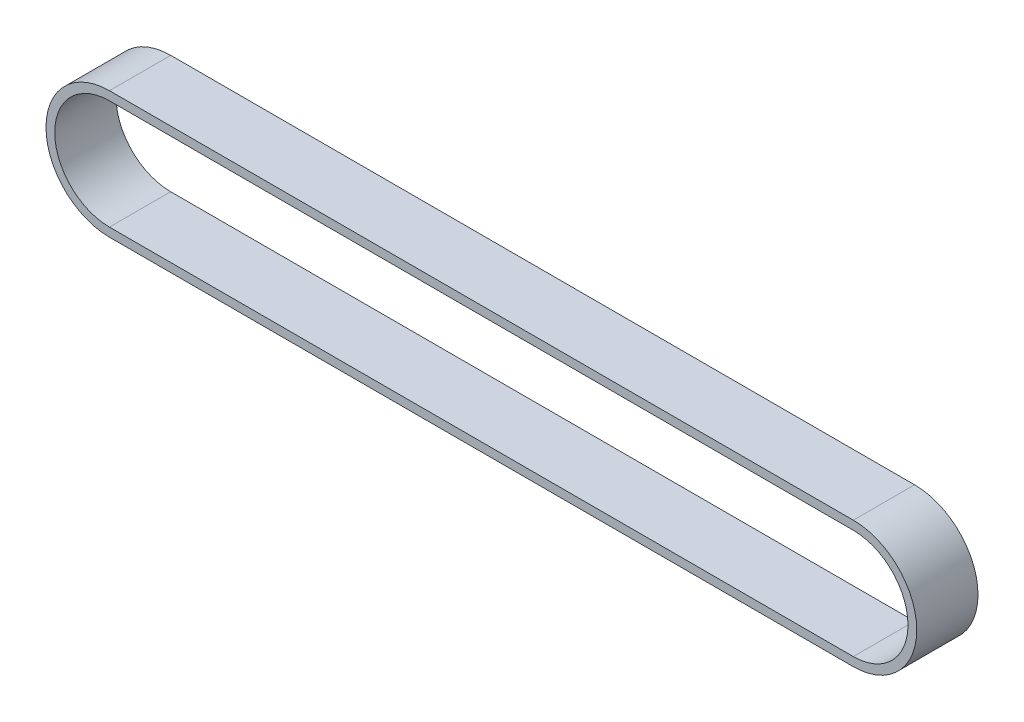
ISO-10303-21;
HEADER;
FILE_DESCRIPTION(('STEP AP214'),'2;1');
FILE_NAME('part.step','',(''),(''),'','','');
FILE_SCHEMA(('AUTOMOTIVE_DESIGN { 1 0 10303 214 1 1 1 1 }'));
ENDSEC;
DATA;
#1=APPLICATION_CONTEXT('core data for automotive mechanical design processes');
#2=APPLICATION_PROTOCOL_DEFINITION('international standard','automotive_design',2000,#1);
#3=PRODUCT_CONTEXT('',#1,'mechanical');
#4=PRODUCT('Part','Part','',(#3));
#5=PRODUCT_RELATED_PRODUCT_CATEGORY('part','',(#4));
#6=PRODUCT_DEFINITION_FORMATION('','',#4);
#7=PRODUCT_DEFINITION_CONTEXT('part definition',#1,'design');
#8=PRODUCT_DEFINITION('design','',#6,#7);
#9=PRODUCT_DEFINITION_SHAPE('','',#8);
#10=(LENGTH_UNIT() NAMED_UNIT(*) SI_UNIT(.MILLI.,.METRE.));
#11=(NAMED_UNIT(*) PLANE_ANGLE_UNIT() SI_UNIT($,.RADIAN.));
#12=(NAMED_UNIT(*) SI_UNIT($,.STERADIAN.) SOLID_ANGLE_UNIT());
#13=UNCERTAINTY_MEASURE_WITH_UNIT(LENGTH_MEASURE(1.E-05),#10,'distance_accuracy_value','');
#14=(GEOMETRIC_REPRESENTATION_CONTEXT(3) GLOBAL_UNCERTAINTY_ASSIGNED_CONTEXT((#13)) GLOBAL_UNIT_ASSIGNED_CONTEXT((#10,
#11,#12)) REPRESENTATION_CONTEXT('',''));
#15=CARTESIAN_POINT('',(0.,0.,0.));
#16=DIRECTION('',(0.,0.,1.));
#17=DIRECTION('',(1.,0.,0.));
#18=AXIS2_PLACEMENT_3D('',#15,#16,#17);
#19=CARTESIAN_POINT('',(-85.,0.,7.));
#20=DIRECTION('',(0.,0.,1.));
#21=DIRECTION('',(1.,0.,0.));
#22=AXIS2_PLACEMENT_3D('',#19,#20,#21);
#23=PLANE('',#22);
#24=CARTESIAN_POINT('',(-85.,0.,7.));
#25=DIRECTION('',(0.,0.,1.));
#26=DIRECTION('',(1.,0.,0.));
#27=AXIS2_PLACEMENT_3D('',#24,#25,#26);
#28=CIRCLE('',#27,14.5);
#29=CARTESIAN_POINT('',(-85.,14.5,7.));
#30=VERTEX_POINT('',#29);
#31=CARTESIAN_POINT('',(-85.,-14.5,7.));
#32=VERTEX_POINT('',#31);
#33=EDGE_CURVE('E139',#30,#32,#28,.T.);
#34=ORIENTED_EDGE('',*,*,#33,.T.);
#35=DIRECTION('',(1.,0.,0.));
#36=VECTOR('',#35,1.);
#37=CARTESIAN_POINT('',(-85.,-14.5,7.));
#38=LINE('',#37,#36);
#39=CARTESIAN_POINT('',(85.,-14.5,7.));
#40=VERTEX_POINT('',#39);
#41=EDGE_CURVE('E142',#32,#40,#38,.T.);
#42=ORIENTED_EDGE('',*,*,#41,.T.);
#43=CARTESIAN_POINT('',(85.,0.,7.));
#44=DIRECTION('',(0.,0.,1.));
#45=DIRECTION('',(-1.,0.,0.));
#46=AXIS2_PLACEMENT_3D('',#43,#44,#45);
#47=CIRCLE('',#46,14.5);
#48=CARTESIAN_POINT('',(85.,14.5,7.));
#49=VERTEX_POINT('',#48);
#50=EDGE_CURVE('E147',#40,#49,#47,.T.);
#51=ORIENTED_EDGE('',*,*,#50,.T.);
#52=DIRECTION('',(-1.,0.,0.));
#53=VECTOR('',#52,1.);
#54=CARTESIAN_POINT('',(-85.,14.5,7.));
#55=LINE('',#54,#53);
#56=EDGE_CURVE('E149',#49,#30,#55,.T.);
#57=ORIENTED_EDGE('',*,*,#56,.T.);
#58=EDGE_LOOP('',(#34,#42,#51,#57));
#59=FACE_BOUND('',#58,.T.);
#60=DIRECTION('',(1.,0.,0.));
#61=VECTOR('',#60,1.);
#62=CARTESIAN_POINT('',(-85.,-12.5,7.));
#63=LINE('',#62,#61);
#64=CARTESIAN_POINT('',(-85.,-12.5,7.));
#65=VERTEX_POINT('',#64);
#66=CARTESIAN_POINT('',(85.,-12.5,7.));
#67=VERTEX_POINT('',#66);
#68=EDGE_CURVE('E115',#65,#67,#63,.T.);
#69=ORIENTED_EDGE('',*,*,#68,.F.);
#70=CARTESIAN_POINT('',(-85.,0.,7.));
#71=DIRECTION('',(0.,0.,1.));
#72=DIRECTION('',(1.,0.,0.));
#73=AXIS2_PLACEMENT_3D('',#70,#71,#72);
#74=CIRCLE('',#73,12.5);
#75=CARTESIAN_POINT('',(-85.,12.5,7.));
#76=VERTEX_POINT('',#75);
#77=EDGE_CURVE('E101',#76,#65,#74,.T.);
#78=ORIENTED_EDGE('',*,*,#77,.F.);
#79=DIRECTION('',(-1.,0.,0.));
#80=VECTOR('',#79,1.);
#81=CARTESIAN_POINT('',(-85.,12.5,7.));
#82=LINE('',#81,#80);
#83=CARTESIAN_POINT('',(85.,12.5,7.));
#84=VERTEX_POINT('',#83);
#85=EDGE_CURVE('E128',#84,#76,#82,.T.);
#86=ORIENTED_EDGE('',*,*,#85,.F.);
#87=CARTESIAN_POINT('',(85.,0.,7.));
#88=DIRECTION('',(0.,0.,1.));
#89=DIRECTION('',(-1.,0.,0.));
#90=AXIS2_PLACEMENT_3D('',#87,#88,#89);
#91=CIRCLE('',#90,12.5);
#92=EDGE_CURVE('E125',#67,#84,#91,.T.);
#93=ORIENTED_EDGE('',*,*,#92,.F.);
#94=EDGE_LOOP('',(#69,#78,#86,#93));
#95=FACE_BOUND('',#94,.T.);
#96=ADVANCED_FACE('F39',(#59,#95),#23,.T.);
#97=CARTESIAN_POINT('',(-85.,0.,-7.));
#98=DIRECTION('',(0.,0.,1.));
#99=DIRECTION('',(1.,0.,0.));
#100=AXIS2_PLACEMENT_3D('',#97,#98,#99);
#101=PLANE('',#100);
#102=CARTESIAN_POINT('',(-85.,0.,-7.));
#103=DIRECTION('',(0.,0.,1.));
#104=DIRECTION('',(1.,0.,0.));
#105=AXIS2_PLACEMENT_3D('',#102,#103,#104);
#106=CIRCLE('',#105,14.5);
#107=CARTESIAN_POINT('',(-85.,14.5,-7.));
#108=VERTEX_POINT('',#107);
#109=CARTESIAN_POINT('',(-85.,-14.5,-7.));
#110=VERTEX_POINT('',#109);
#111=EDGE_CURVE('E120',#108,#110,#106,.T.);
#112=ORIENTED_EDGE('',*,*,#111,.F.);
#113=DIRECTION('',(-1.,0.,0.));
#114=VECTOR('',#113,1.);
#115=CARTESIAN_POINT('',(-85.,14.5,-7.));
#116=LINE('',#115,#114);
#117=CARTESIAN_POINT('',(85.,14.5,-7.));
#118=VERTEX_POINT('',#117);
#119=EDGE_CURVE('E143',#118,#108,#116,.T.);
#120=ORIENTED_EDGE('',*,*,#119,.F.);
#121=CARTESIAN_POINT('',(85.,0.,-7.));
#122=DIRECTION('',(0.,0.,1.));
#123=DIRECTION('',(-1.,0.,0.));
#124=AXIS2_PLACEMENT_3D('',#121,#122,#123);
#125=CIRCLE('',#124,14.5);
#126=CARTESIAN_POINT('',(85.,-14.5,-7.));
#127=VERTEX_POINT('',#126);
#128=EDGE_CURVE('E155',#127,#118,#125,.T.);
#129=ORIENTED_EDGE('',*,*,#128,.F.);
#130=DIRECTION('',(1.,0.,0.));
#131=VECTOR('',#130,1.);
#132=CARTESIAN_POINT('',(-85.,-14.5,-7.));
#133=LINE('',#132,#131);
#134=EDGE_CURVE('E154',#110,#127,#133,.T.);
#135=ORIENTED_EDGE('',*,*,#134,.F.);
#136=EDGE_LOOP('',(#112,#120,#129,#135));
#137=FACE_BOUND('',#136,.T.);
#138=CARTESIAN_POINT('',(-85.,0.,-7.));
#139=DIRECTION('',(0.,0.,1.));
#140=DIRECTION('',(1.,0.,0.));
#141=AXIS2_PLACEMENT_3D('',#138,#139,#140);
#142=CIRCLE('',#141,12.5);
#143=CARTESIAN_POINT('',(-85.,12.5,-7.));
#144=VERTEX_POINT('',#143);
#145=CARTESIAN_POINT('',(-85.,-12.5,-7.));
#146=VERTEX_POINT('',#145);
#147=EDGE_CURVE('E62',#144,#146,#142,.T.);
#148=ORIENTED_EDGE('',*,*,#147,.T.);
#149=DIRECTION('',(1.,0.,0.));
#150=VECTOR('',#149,1.);
#151=CARTESIAN_POINT('',(-85.,-12.5,-7.));
#152=LINE('',#151,#150);
#153=CARTESIAN_POINT('',(85.,-12.5,-7.));
#154=VERTEX_POINT('',#153);
#155=EDGE_CURVE('E118',#146,#154,#152,.T.);
#156=ORIENTED_EDGE('',*,*,#155,.T.);
#157=CARTESIAN_POINT('',(85.,0.,-7.));
#158=DIRECTION('',(0.,0.,1.));
#159=DIRECTION('',(-1.,0.,0.));
#160=AXIS2_PLACEMENT_3D('',#157,#158,#159);
#161=CIRCLE('',#160,12.5);
#162=CARTESIAN_POINT('',(85.,12.5,-7.));
#163=VERTEX_POINT('',#162);
#164=EDGE_CURVE('E135',#154,#163,#161,.T.);
#165=ORIENTED_EDGE('',*,*,#164,.T.);
#166=DIRECTION('',(-1.,0.,0.));
#167=VECTOR('',#166,1.);
#168=CARTESIAN_POINT('',(-85.,12.5,-7.));
#169=LINE('',#168,#167);
#170=EDGE_CURVE('E111',#163,#144,#169,.T.);
#171=ORIENTED_EDGE('',*,*,#170,.T.);
#172=EDGE_LOOP('',(#148,#156,#165,#171));
#173=FACE_BOUND('',#172,.T.);
#174=ADVANCED_FACE('F171',(#137,#173),#101,.F.);
#175=CARTESIAN_POINT('',(-85.,0.,7.));
#176=DIRECTION('',(0.,0.,-1.));
#177=DIRECTION('',(-1.,0.,0.));
#178=AXIS2_PLACEMENT_3D('',#175,#176,#177);
#179=CYLINDRICAL_SURFACE('',#178,14.5);
#180=ORIENTED_EDGE('',*,*,#111,.T.);
#181=DIRECTION('',(0.,0.,-1.));
#182=VECTOR('',#181,1.);
#183=CARTESIAN_POINT('',(-85.,-14.5,7.));
#184=LINE('',#183,#182);
#185=EDGE_CURVE('E11',#32,#110,#184,.T.);
#186=ORIENTED_EDGE('',*,*,#185,.F.);
#187=ORIENTED_EDGE('',*,*,#33,.F.);
#188=DIRECTION('',(0.,0.,-1.));
#189=VECTOR('',#188,1.);
#190=CARTESIAN_POINT('',(-85.,14.5,7.));
#191=LINE('',#190,#189);
#192=EDGE_CURVE('E148',#30,#108,#191,.T.);
#193=ORIENTED_EDGE('',*,*,#192,.T.);
#194=EDGE_LOOP('',(#180,#186,#187,#193));
#195=FACE_BOUND('',#194,.T.);
#196=ADVANCED_FACE('F41',(#195),#179,.T.);
#197=CARTESIAN_POINT('',(-85.,-14.5,7.));
#198=DIRECTION('',(0.,1.,0.));
#199=DIRECTION('',(0.,0.,1.));
#200=AXIS2_PLACEMENT_3D('',#197,#198,#199);
#201=PLANE('',#200);
#202=ORIENTED_EDGE('',*,*,#134,.T.);
#203=DIRECTION('',(0.,0.,-1.));
#204=VECTOR('',#203,1.);
#205=CARTESIAN_POINT('',(85.,-14.5,7.));
#206=LINE('',#205,#204);
#207=EDGE_CURVE('E50',#40,#127,#206,.T.);
#208=ORIENTED_EDGE('',*,*,#207,.F.);
#209=ORIENTED_EDGE('',*,*,#41,.F.);
#210=ORIENTED_EDGE('',*,*,#185,.T.);
#211=EDGE_LOOP('',(#202,#208,#209,#210));
#212=FACE_BOUND('',#211,.T.);
#213=ADVANCED_FACE('F183',(#212),#201,.F.);
#214=CARTESIAN_POINT('',(85.,0.,7.));
#215=DIRECTION('',(0.,0.,-1.));
#216=DIRECTION('',(-1.,0.,0.));
#217=AXIS2_PLACEMENT_3D('',#214,#215,#216);
#218=CYLINDRICAL_SURFACE('',#217,14.5);
#219=ORIENTED_EDGE('',*,*,#128,.T.);
#220=DIRECTION('',(0.,0.,-1.));
#221=VECTOR('',#220,1.);
#222=CARTESIAN_POINT('',(85.,14.5,7.));
#223=LINE('',#222,#221);
#224=EDGE_CURVE('E158',#49,#118,#223,.T.);
#225=ORIENTED_EDGE('',*,*,#224,.F.);
#226=ORIENTED_EDGE('',*,*,#50,.F.);
#227=ORIENTED_EDGE('',*,*,#207,.T.);
#228=EDGE_LOOP('',(#219,#225,#226,#227));
#229=FACE_BOUND('',#228,.T.);
#230=ADVANCED_FACE('F167',(#229),#218,.T.);
#231=CARTESIAN_POINT('',(-85.,14.5,7.));
#232=DIRECTION('',(0.,-1.,0.));
#233=DIRECTION('',(0.,0.,-1.));
#234=AXIS2_PLACEMENT_3D('',#231,#232,#233);
#235=PLANE('',#234);
#236=ORIENTED_EDGE('',*,*,#119,.T.);
#237=ORIENTED_EDGE('',*,*,#192,.F.);
#238=ORIENTED_EDGE('',*,*,#56,.F.);
#239=ORIENTED_EDGE('',*,*,#224,.T.);
#240=EDGE_LOOP('',(#236,#237,#238,#239));
#241=FACE_BOUND('',#240,.T.);
#242=ADVANCED_FACE('F180',(#241),#235,.F.);
#243=CARTESIAN_POINT('',(-85.,0.,7.));
#244=DIRECTION('',(0.,0.,-1.));
#245=DIRECTION('',(-1.,0.,0.));
#246=AXIS2_PLACEMENT_3D('',#243,#244,#245);
#247=CYLINDRICAL_SURFACE('',#246,12.5);
#248=ORIENTED_EDGE('',*,*,#147,.F.);
#249=DIRECTION('',(0.,0.,-1.));
#250=VECTOR('',#249,1.);
#251=CARTESIAN_POINT('',(-85.,12.5,7.));
#252=LINE('',#251,#250);
#253=EDGE_CURVE('E109',#76,#144,#252,.T.);
#254=ORIENTED_EDGE('',*,*,#253,.F.);
#255=ORIENTED_EDGE('',*,*,#77,.T.);
#256=DIRECTION('',(0.,0.,-1.));
#257=VECTOR('',#256,1.);
#258=CARTESIAN_POINT('',(-85.,-12.5,7.));
#259=LINE('',#258,#257);
#260=EDGE_CURVE('E107',#65,#146,#259,.T.);
#261=ORIENTED_EDGE('',*,*,#260,.T.);
#262=EDGE_LOOP('',(#248,#254,#255,#261));
#263=FACE_BOUND('',#262,.T.);
#264=ADVANCED_FACE('F106',(#263),#247,.F.);
#265=CARTESIAN_POINT('',(-85.,-12.5,7.));
#266=DIRECTION('',(0.,1.,0.));
#267=DIRECTION('',(0.,0.,1.));
#268=AXIS2_PLACEMENT_3D('',#265,#266,#267);
#269=PLANE('',#268);
#270=ORIENTED_EDGE('',*,*,#155,.F.);
#271=ORIENTED_EDGE('',*,*,#260,.F.);
#272=ORIENTED_EDGE('',*,*,#68,.T.);
#273=DIRECTION('',(0.,0.,-1.));
#274=VECTOR('',#273,1.);
#275=CARTESIAN_POINT('',(85.,-12.5,7.));
#276=LINE('',#275,#274);
#277=EDGE_CURVE('E123',#67,#154,#276,.T.);
#278=ORIENTED_EDGE('',*,*,#277,.T.);
#279=EDGE_LOOP('',(#270,#271,#272,#278));
#280=FACE_BOUND('',#279,.T.);
#281=ADVANCED_FACE('F116',(#280),#269,.T.);
#282=CARTESIAN_POINT('',(85.,0.,7.));
#283=DIRECTION('',(0.,0.,-1.));
#284=DIRECTION('',(-1.,0.,0.));
#285=AXIS2_PLACEMENT_3D('',#282,#283,#284);
#286=CYLINDRICAL_SURFACE('',#285,12.5);
#287=ORIENTED_EDGE('',*,*,#164,.F.);
#288=ORIENTED_EDGE('',*,*,#277,.F.);
#289=ORIENTED_EDGE('',*,*,#92,.T.);
#290=DIRECTION('',(0.,0.,-1.));
#291=VECTOR('',#290,1.);
#292=CARTESIAN_POINT('',(85.,12.5,7.));
#293=LINE('',#292,#291);
#294=EDGE_CURVE('E53',#84,#163,#293,.T.);
#295=ORIENTED_EDGE('',*,*,#294,.T.);
#296=EDGE_LOOP('',(#287,#288,#289,#295));
#297=FACE_BOUND('',#296,.T.);
#298=ADVANCED_FACE('F206',(#297),#286,.F.);
#299=CARTESIAN_POINT('',(-85.,12.5,7.));
#300=DIRECTION('',(0.,-1.,0.));
#301=DIRECTION('',(0.,0.,-1.));
#302=AXIS2_PLACEMENT_3D('',#299,#300,#301);
#303=PLANE('',#302);
#304=ORIENTED_EDGE('',*,*,#170,.F.);
#305=ORIENTED_EDGE('',*,*,#294,.F.);
#306=ORIENTED_EDGE('',*,*,#85,.T.);
#307=ORIENTED_EDGE('',*,*,#253,.T.);
#308=EDGE_LOOP('',(#304,#305,#306,#307));
#309=FACE_BOUND('',#308,.T.);
#310=ADVANCED_FACE('F210',(#309),#303,.T.);
#311=CLOSED_SHELL('',(#96,#174,#196,#213,#230,#242,#264,#281,#298,#310));
#312=MANIFOLD_SOLID_BREP('B2',#311);
#313=ADVANCED_BREP_SHAPE_REPRESENTATION('',(#18,#312),#14);
#314=SHAPE_DEFINITION_REPRESENTATION(#9,#313);
ENDSEC;
END-ISO-10303-21;
